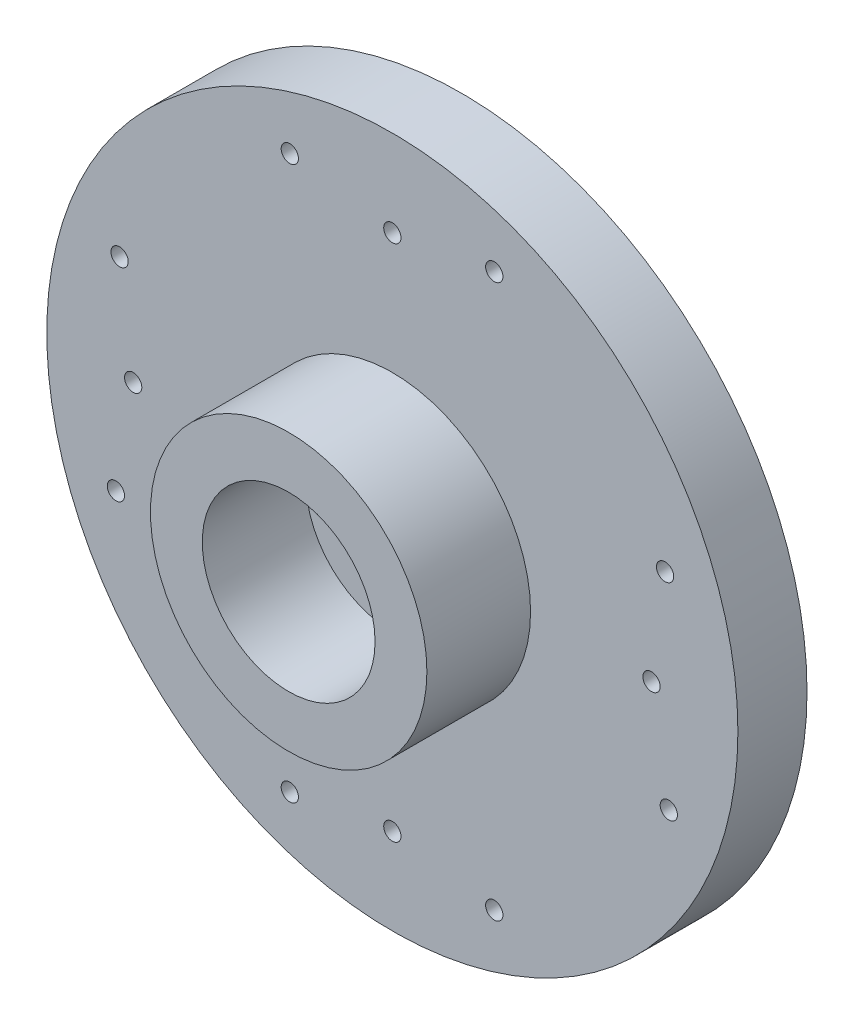
ISO-10303-21;
HEADER;
FILE_DESCRIPTION(('STEP AP214'),'2;1');
FILE_NAME('part.step','',(''),(''),'','','');
FILE_SCHEMA(('AUTOMOTIVE_DESIGN { 1 0 10303 214 1 1 1 1 }'));
ENDSEC;
DATA;
#1=APPLICATION_CONTEXT('core data for automotive mechanical design processes');
#2=APPLICATION_PROTOCOL_DEFINITION('international standard','automotive_design',2000,#1);
#3=PRODUCT_CONTEXT('',#1,'mechanical');
#4=PRODUCT('Part','Part','',(#3));
#5=PRODUCT_RELATED_PRODUCT_CATEGORY('part','',(#4));
#6=PRODUCT_DEFINITION_FORMATION('','',#4);
#7=PRODUCT_DEFINITION_CONTEXT('part definition',#1,'design');
#8=PRODUCT_DEFINITION('design','',#6,#7);
#9=PRODUCT_DEFINITION_SHAPE('','',#8);
#10=(LENGTH_UNIT() NAMED_UNIT(*) SI_UNIT(.MILLI.,.METRE.));
#11=(NAMED_UNIT(*) PLANE_ANGLE_UNIT() SI_UNIT($,.RADIAN.));
#12=(NAMED_UNIT(*) SI_UNIT($,.STERADIAN.) SOLID_ANGLE_UNIT());
#13=UNCERTAINTY_MEASURE_WITH_UNIT(LENGTH_MEASURE(1.E-05),#10,'distance_accuracy_value','');
#14=(GEOMETRIC_REPRESENTATION_CONTEXT(3) GLOBAL_UNCERTAINTY_ASSIGNED_CONTEXT((#13)) GLOBAL_UNIT_ASSIGNED_CONTEXT((#10,
#11,#12)) REPRESENTATION_CONTEXT('',''));
#15=CARTESIAN_POINT('',(0.,0.,0.));
#16=DIRECTION('',(0.,0.,1.));
#17=DIRECTION('',(1.,0.,0.));
#18=AXIS2_PLACEMENT_3D('',#15,#16,#17);
#19=CARTESIAN_POINT('',(0.,0.,2.4));
#20=DIRECTION('',(0.,0.,-1.));
#21=DIRECTION('',(-1.,0.,0.));
#22=AXIS2_PLACEMENT_3D('',#19,#20,#21);
#23=CYLINDRICAL_SURFACE('',#22,1.2);
#24=CARTESIAN_POINT('',(0.,0.,2.4));
#25=DIRECTION('',(0.,0.,1.));
#26=DIRECTION('',(1.,0.,0.));
#27=AXIS2_PLACEMENT_3D('',#24,#25,#26);
#28=CIRCLE('',#27,1.2);
#29=CARTESIAN_POINT('',(1.2,0.,2.4));
#30=VERTEX_POINT('',#29);
#31=EDGE_CURVE('E120',#30,#30,#28,.T.);
#32=ORIENTED_EDGE('',*,*,#31,.T.);
#33=EDGE_LOOP('',(#32));
#34=FACE_BOUND('',#33,.T.);
#35=CARTESIAN_POINT('',(0.,0.,0.6));
#36=DIRECTION('',(0.,0.,-1.));
#37=DIRECTION('',(-1.,0.,0.));
#38=AXIS2_PLACEMENT_3D('',#35,#36,#37);
#39=CIRCLE('',#38,1.2);
#40=CARTESIAN_POINT('',(-1.2,0.,0.6));
#41=VERTEX_POINT('',#40);
#42=EDGE_CURVE('E40',#41,#41,#39,.T.);
#43=ORIENTED_EDGE('',*,*,#42,.T.);
#44=EDGE_LOOP('',(#43));
#45=FACE_BOUND('',#44,.T.);
#46=ADVANCED_FACE('F36',(#34,#45),#23,.F.);
#47=CARTESIAN_POINT('',(0.,0.,2.4));
#48=DIRECTION('',(0.,0.,1.));
#49=DIRECTION('',(1.,0.,0.));
#50=AXIS2_PLACEMENT_3D('',#47,#48,#49);
#51=PLANE('',#50);
#52=CARTESIAN_POINT('',(3.53932517107282,9.6,2.4));
#53=DIRECTION('',(0.,0.,1.));
#54=DIRECTION('',(1.,0.,0.));
#55=AXIS2_PLACEMENT_3D('',#52,#53,#54);
#56=CIRCLE('',#55,0.3);
#57=CARTESIAN_POINT('',(3.83932517107282,9.6,2.4));
#58=VERTEX_POINT('',#57);
#59=EDGE_CURVE('E235',#58,#58,#56,.T.);
#60=ORIENTED_EDGE('',*,*,#59,.F.);
#61=EDGE_LOOP('',(#60));
#62=FACE_BOUND('',#61,.T.);
#63=CARTESIAN_POINT('',(0.,9.,2.4));
#64=DIRECTION('',(0.,0.,1.));
#65=DIRECTION('',(1.,0.,0.));
#66=AXIS2_PLACEMENT_3D('',#63,#64,#65);
#67=CIRCLE('',#66,0.3);
#68=CARTESIAN_POINT('',(0.300000000000001,9.,2.4));
#69=VERTEX_POINT('',#68);
#70=EDGE_CURVE('E227',#69,#69,#67,.T.);
#71=ORIENTED_EDGE('',*,*,#70,.F.);
#72=EDGE_LOOP('',(#71));
#73=FACE_BOUND('',#72,.T.);
#74=CARTESIAN_POINT('',(-3.56067482892718,9.6,2.4));
#75=DIRECTION('',(0.,0.,1.));
#76=DIRECTION('',(1.,0.,0.));
#77=AXIS2_PLACEMENT_3D('',#74,#75,#76);
#78=CIRCLE('',#77,0.3);
#79=CARTESIAN_POINT('',(-3.26067482892718,9.6,2.4));
#80=VERTEX_POINT('',#79);
#81=EDGE_CURVE('E212',#80,#80,#78,.T.);
#82=ORIENTED_EDGE('',*,*,#81,.F.);
#83=EDGE_LOOP('',(#82));
#84=FACE_BOUND('',#83,.T.);
#85=CARTESIAN_POINT('',(-9.,0.,2.4));
#86=DIRECTION('',(0.,0.,1.));
#87=DIRECTION('',(1.,0.,0.));
#88=AXIS2_PLACEMENT_3D('',#85,#86,#87);
#89=CIRCLE('',#88,0.3);
#90=CARTESIAN_POINT('',(-8.7,0.,2.4));
#91=VERTEX_POINT('',#90);
#92=EDGE_CURVE('E268',#91,#91,#89,.T.);
#93=ORIENTED_EDGE('',*,*,#92,.F.);
#94=EDGE_LOOP('',(#93));
#95=FACE_BOUND('',#94,.T.);
#96=CARTESIAN_POINT('',(-9.6,-3.56067482892722,2.4));
#97=DIRECTION('',(0.,0.,1.));
#98=DIRECTION('',(1.,0.,0.));
#99=AXIS2_PLACEMENT_3D('',#96,#97,#98);
#100=CIRCLE('',#99,0.3);
#101=CARTESIAN_POINT('',(-9.3,-3.56067482892722,2.4));
#102=VERTEX_POINT('',#101);
#103=EDGE_CURVE('E272',#102,#102,#100,.T.);
#104=ORIENTED_EDGE('',*,*,#103,.F.);
#105=EDGE_LOOP('',(#104));
#106=FACE_BOUND('',#105,.T.);
#107=CARTESIAN_POINT('',(9.,0.,2.4));
#108=DIRECTION('',(0.,0.,1.));
#109=DIRECTION('',(1.,0.,0.));
#110=AXIS2_PLACEMENT_3D('',#107,#108,#109);
#111=CIRCLE('',#110,0.3);
#112=CARTESIAN_POINT('',(9.3,0.,2.4));
#113=VERTEX_POINT('',#112);
#114=EDGE_CURVE('E238',#113,#113,#111,.F.);
#115=ORIENTED_EDGE('',*,*,#114,.T.);
#116=EDGE_LOOP('',(#115));
#117=FACE_BOUND('',#116,.T.);
#118=CARTESIAN_POINT('',(-3.56067482892718,-9.6,2.4));
#119=DIRECTION('',(0.,0.,1.));
#120=DIRECTION('',(1.,0.,0.));
#121=AXIS2_PLACEMENT_3D('',#118,#119,#120);
#122=CIRCLE('',#121,0.3);
#123=CARTESIAN_POINT('',(-3.26067482892718,-9.6,2.4));
#124=VERTEX_POINT('',#123);
#125=EDGE_CURVE('E232',#124,#124,#122,.F.);
#126=ORIENTED_EDGE('',*,*,#125,.T.);
#127=EDGE_LOOP('',(#126));
#128=FACE_BOUND('',#127,.T.);
#129=CARTESIAN_POINT('',(9.6,-3.56067482892722,2.4));
#130=DIRECTION('',(0.,0.,1.));
#131=DIRECTION('',(1.,0.,0.));
#132=AXIS2_PLACEMENT_3D('',#129,#130,#131);
#133=CIRCLE('',#132,0.3);
#134=CARTESIAN_POINT('',(9.9,-3.56067482892722,2.4));
#135=VERTEX_POINT('',#134);
#136=EDGE_CURVE('E261',#135,#135,#133,.F.);
#137=ORIENTED_EDGE('',*,*,#136,.T.);
#138=EDGE_LOOP('',(#137));
#139=FACE_BOUND('',#138,.T.);
#140=CARTESIAN_POINT('',(-9.4711699275262,3.54215691710382,2.4));
#141=DIRECTION('',(0.,0.,1.));
#142=DIRECTION('',(1.,0.,0.));
#143=AXIS2_PLACEMENT_3D('',#140,#141,#142);
#144=CIRCLE('',#143,0.3);
#145=CARTESIAN_POINT('',(-9.1711699275262,3.54215691710382,2.4));
#146=VERTEX_POINT('',#145);
#147=EDGE_CURVE('E60',#146,#146,#144,.T.);
#148=ORIENTED_EDGE('',*,*,#147,.F.);
#149=EDGE_LOOP('',(#148));
#150=FACE_BOUND('',#149,.T.);
#151=CARTESIAN_POINT('',(0.,0.,2.4));
#152=DIRECTION('',(0.,0.,1.));
#153=DIRECTION('',(1.,0.,0.));
#154=AXIS2_PLACEMENT_3D('',#151,#152,#153);
#155=CIRCLE('',#154,4.8);
#156=CARTESIAN_POINT('',(4.8,0.,2.4));
#157=VERTEX_POINT('',#156);
#158=EDGE_CURVE('E107',#157,#157,#155,.T.);
#159=ORIENTED_EDGE('',*,*,#158,.F.);
#160=EDGE_LOOP('',(#159));
#161=FACE_BOUND('',#160,.T.);
#162=CARTESIAN_POINT('',(0.,0.,2.4));
#163=DIRECTION('',(0.,0.,1.));
#164=DIRECTION('',(1.,0.,0.));
#165=AXIS2_PLACEMENT_3D('',#162,#163,#164);
#166=CIRCLE('',#165,12.);
#167=CARTESIAN_POINT('',(12.,0.,2.4));
#168=VERTEX_POINT('',#167);
#169=EDGE_CURVE('E45',#168,#168,#166,.T.);
#170=ORIENTED_EDGE('',*,*,#169,.T.);
#171=EDGE_LOOP('',(#170));
#172=FACE_BOUND('',#171,.T.);
#173=CARTESIAN_POINT('',(0.,-9.,2.4));
#174=DIRECTION('',(0.,0.,1.));
#175=DIRECTION('',(1.,0.,0.));
#176=AXIS2_PLACEMENT_3D('',#173,#174,#175);
#177=CIRCLE('',#176,0.3);
#178=CARTESIAN_POINT('',(0.299999999999994,-9.,2.4));
#179=VERTEX_POINT('',#178);
#180=EDGE_CURVE('E259',#179,#179,#177,.F.);
#181=ORIENTED_EDGE('',*,*,#180,.T.);
#182=EDGE_LOOP('',(#181));
#183=FACE_BOUND('',#182,.T.);
#184=CARTESIAN_POINT('',(3.53932517107282,-9.6,2.4));
#185=DIRECTION('',(0.,0.,1.));
#186=DIRECTION('',(1.,0.,0.));
#187=AXIS2_PLACEMENT_3D('',#184,#185,#186);
#188=CIRCLE('',#187,0.3);
#189=CARTESIAN_POINT('',(3.83932517107282,-9.6,2.4));
#190=VERTEX_POINT('',#189);
#191=EDGE_CURVE('E226',#190,#190,#188,.F.);
#192=ORIENTED_EDGE('',*,*,#191,.T.);
#193=EDGE_LOOP('',(#192));
#194=FACE_BOUND('',#193,.T.);
#195=CARTESIAN_POINT('',(9.4711699275262,3.54215691710382,2.4));
#196=DIRECTION('',(0.,0.,1.));
#197=DIRECTION('',(1.,0.,0.));
#198=AXIS2_PLACEMENT_3D('',#195,#196,#197);
#199=CIRCLE('',#198,0.3);
#200=CARTESIAN_POINT('',(9.7711699275262,3.54215691710382,2.4));
#201=VERTEX_POINT('',#200);
#202=EDGE_CURVE('E275',#201,#201,#199,.F.);
#203=ORIENTED_EDGE('',*,*,#202,.T.);
#204=EDGE_LOOP('',(#203));
#205=FACE_BOUND('',#204,.T.);
#206=ADVANCED_FACE('F135',(#62,#73,#84,#95,#106,#117,#128,#139,#150,#161,#172,#183,#194,#205),
#51,.T.);
#207=CARTESIAN_POINT('',(0.,0.,0.));
#208=DIRECTION('',(0.,0.,1.));
#209=DIRECTION('',(1.,0.,0.));
#210=AXIS2_PLACEMENT_3D('',#207,#208,#209);
#211=PLANE('',#210);
#212=CARTESIAN_POINT('',(0.,0.,0.));
#213=DIRECTION('',(0.,0.,-1.));
#214=DIRECTION('',(-1.,0.,0.));
#215=AXIS2_PLACEMENT_3D('',#212,#213,#214);
#216=CIRCLE('',#215,3.6);
#217=CARTESIAN_POINT('',(-3.6,0.,0.));
#218=VERTEX_POINT('',#217);
#219=EDGE_CURVE('E249',#218,#218,#216,.T.);
#220=ORIENTED_EDGE('',*,*,#219,.F.);
#221=EDGE_LOOP('',(#220));
#222=FACE_BOUND('',#221,.T.);
#223=CARTESIAN_POINT('',(3.53932517107282,9.6,0.));
#224=DIRECTION('',(0.,0.,1.));
#225=DIRECTION('',(1.,0.,0.));
#226=AXIS2_PLACEMENT_3D('',#223,#224,#225);
#227=CIRCLE('',#226,0.3);
#228=CARTESIAN_POINT('',(3.83932517107282,9.6,0.));
#229=VERTEX_POINT('',#228);
#230=EDGE_CURVE('E99',#229,#229,#227,.T.);
#231=ORIENTED_EDGE('',*,*,#230,.T.);
#232=EDGE_LOOP('',(#231));
#233=FACE_BOUND('',#232,.T.);
#234=CARTESIAN_POINT('',(0.,9.,0.));
#235=DIRECTION('',(0.,0.,1.));
#236=DIRECTION('',(1.,0.,0.));
#237=AXIS2_PLACEMENT_3D('',#234,#235,#236);
#238=CIRCLE('',#237,0.3);
#239=CARTESIAN_POINT('',(0.300000000000001,9.,0.));
#240=VERTEX_POINT('',#239);
#241=EDGE_CURVE('E96',#240,#240,#238,.T.);
#242=ORIENTED_EDGE('',*,*,#241,.T.);
#243=EDGE_LOOP('',(#242));
#244=FACE_BOUND('',#243,.T.);
#245=CARTESIAN_POINT('',(-3.56067482892718,9.6,0.));
#246=DIRECTION('',(0.,0.,1.));
#247=DIRECTION('',(1.,0.,0.));
#248=AXIS2_PLACEMENT_3D('',#245,#246,#247);
#249=CIRCLE('',#248,0.3);
#250=CARTESIAN_POINT('',(-3.26067482892718,9.6,0.));
#251=VERTEX_POINT('',#250);
#252=EDGE_CURVE('E92',#251,#251,#249,.T.);
#253=ORIENTED_EDGE('',*,*,#252,.T.);
#254=EDGE_LOOP('',(#253));
#255=FACE_BOUND('',#254,.T.);
#256=CARTESIAN_POINT('',(-9.,0.,0.));
#257=DIRECTION('',(0.,0.,1.));
#258=DIRECTION('',(1.,0.,0.));
#259=AXIS2_PLACEMENT_3D('',#256,#257,#258);
#260=CIRCLE('',#259,0.3);
#261=CARTESIAN_POINT('',(-8.7,0.,0.));
#262=VERTEX_POINT('',#261);
#263=EDGE_CURVE('E88',#262,#262,#260,.T.);
#264=ORIENTED_EDGE('',*,*,#263,.T.);
#265=EDGE_LOOP('',(#264));
#266=FACE_BOUND('',#265,.T.);
#267=CARTESIAN_POINT('',(-9.6,-3.56067482892722,0.));
#268=DIRECTION('',(0.,0.,1.));
#269=DIRECTION('',(1.,0.,0.));
#270=AXIS2_PLACEMENT_3D('',#267,#268,#269);
#271=CIRCLE('',#270,0.3);
#272=CARTESIAN_POINT('',(-9.3,-3.56067482892722,0.));
#273=VERTEX_POINT('',#272);
#274=EDGE_CURVE('E84',#273,#273,#271,.T.);
#275=ORIENTED_EDGE('',*,*,#274,.T.);
#276=EDGE_LOOP('',(#275));
#277=FACE_BOUND('',#276,.T.);
#278=CARTESIAN_POINT('',(-9.4711699275262,3.54215691710382,0.));
#279=DIRECTION('',(0.,0.,1.));
#280=DIRECTION('',(1.,0.,0.));
#281=AXIS2_PLACEMENT_3D('',#278,#279,#280);
#282=CIRCLE('',#281,0.3);
#283=CARTESIAN_POINT('',(-9.1711699275262,3.54215691710382,0.));
#284=VERTEX_POINT('',#283);
#285=EDGE_CURVE('E55',#284,#284,#282,.T.);
#286=ORIENTED_EDGE('',*,*,#285,.T.);
#287=EDGE_LOOP('',(#286));
#288=FACE_BOUND('',#287,.T.);
#289=CARTESIAN_POINT('',(0.,0.,0.));
#290=DIRECTION('',(0.,0.,1.));
#291=DIRECTION('',(1.,0.,0.));
#292=AXIS2_PLACEMENT_3D('',#289,#290,#291);
#293=CIRCLE('',#292,12.);
#294=CARTESIAN_POINT('',(12.,0.,0.));
#295=VERTEX_POINT('',#294);
#296=EDGE_CURVE('E51',#295,#295,#293,.T.);
#297=ORIENTED_EDGE('',*,*,#296,.F.);
#298=EDGE_LOOP('',(#297));
#299=FACE_BOUND('',#298,.T.);
#300=CARTESIAN_POINT('',(9.6,-3.56067482892722,0.));
#301=DIRECTION('',(0.,0.,1.));
#302=DIRECTION('',(1.,0.,0.));
#303=AXIS2_PLACEMENT_3D('',#300,#301,#302);
#304=CIRCLE('',#303,0.3);
#305=CARTESIAN_POINT('',(9.9,-3.56067482892722,0.));
#306=VERTEX_POINT('',#305);
#307=EDGE_CURVE('E59',#306,#306,#304,.F.);
#308=ORIENTED_EDGE('',*,*,#307,.F.);
#309=EDGE_LOOP('',(#308));
#310=FACE_BOUND('',#309,.T.);
#311=CARTESIAN_POINT('',(0.,-9.,0.));
#312=DIRECTION('',(0.,0.,1.));
#313=DIRECTION('',(1.,0.,0.));
#314=AXIS2_PLACEMENT_3D('',#311,#312,#313);
#315=CIRCLE('',#314,0.3);
#316=CARTESIAN_POINT('',(0.299999999999994,-9.,0.));
#317=VERTEX_POINT('',#316);
#318=EDGE_CURVE('E64',#317,#317,#315,.F.);
#319=ORIENTED_EDGE('',*,*,#318,.F.);
#320=EDGE_LOOP('',(#319));
#321=FACE_BOUND('',#320,.T.);
#322=CARTESIAN_POINT('',(-3.56067482892718,-9.6,0.));
#323=DIRECTION('',(0.,0.,1.));
#324=DIRECTION('',(1.,0.,0.));
#325=AXIS2_PLACEMENT_3D('',#322,#323,#324);
#326=CIRCLE('',#325,0.3);
#327=CARTESIAN_POINT('',(-3.26067482892718,-9.6,0.));
#328=VERTEX_POINT('',#327);
#329=EDGE_CURVE('E68',#328,#328,#326,.F.);
#330=ORIENTED_EDGE('',*,*,#329,.F.);
#331=EDGE_LOOP('',(#330));
#332=FACE_BOUND('',#331,.T.);
#333=CARTESIAN_POINT('',(3.53932517107282,-9.6,0.));
#334=DIRECTION('',(0.,0.,1.));
#335=DIRECTION('',(1.,0.,0.));
#336=AXIS2_PLACEMENT_3D('',#333,#334,#335);
#337=CIRCLE('',#336,0.3);
#338=CARTESIAN_POINT('',(3.83932517107282,-9.6,0.));
#339=VERTEX_POINT('',#338);
#340=EDGE_CURVE('E72',#339,#339,#337,.F.);
#341=ORIENTED_EDGE('',*,*,#340,.F.);
#342=EDGE_LOOP('',(#341));
#343=FACE_BOUND('',#342,.T.);
#344=CARTESIAN_POINT('',(9.,0.,0.));
#345=DIRECTION('',(0.,0.,1.));
#346=DIRECTION('',(1.,0.,0.));
#347=AXIS2_PLACEMENT_3D('',#344,#345,#346);
#348=CIRCLE('',#347,0.3);
#349=CARTESIAN_POINT('',(9.3,0.,0.));
#350=VERTEX_POINT('',#349);
#351=EDGE_CURVE('E76',#350,#350,#348,.F.);
#352=ORIENTED_EDGE('',*,*,#351,.F.);
#353=EDGE_LOOP('',(#352));
#354=FACE_BOUND('',#353,.T.);
#355=CARTESIAN_POINT('',(9.4711699275262,3.54215691710382,0.));
#356=DIRECTION('',(0.,0.,1.));
#357=DIRECTION('',(1.,0.,0.));
#358=AXIS2_PLACEMENT_3D('',#355,#356,#357);
#359=CIRCLE('',#358,0.3);
#360=CARTESIAN_POINT('',(9.7711699275262,3.54215691710382,0.));
#361=VERTEX_POINT('',#360);
#362=EDGE_CURVE('E80',#361,#361,#359,.F.);
#363=ORIENTED_EDGE('',*,*,#362,.F.);
#364=EDGE_LOOP('',(#363));
#365=FACE_BOUND('',#364,.T.);
#366=ADVANCED_FACE('F131',(#222,#233,#244,#255,#266,#277,#288,#299,#310,#321,#332,#343,#354,
#365),#211,.F.);
#367=ORIENTED_EDGE('',*,*,#31,.F.);
#368=EDGE_LOOP('',(#367));
#369=FACE_BOUND('',#368,.T.);
#370=CARTESIAN_POINT('',(0.,0.,2.4));
#371=DIRECTION('',(0.,0.,1.));
#372=DIRECTION('',(1.,0.,0.));
#373=AXIS2_PLACEMENT_3D('',#370,#371,#372);
#374=CIRCLE('',#373,3.);
#375=CARTESIAN_POINT('',(3.,0.,2.4));
#376=VERTEX_POINT('',#375);
#377=EDGE_CURVE('E10',#376,#376,#374,.F.);
#378=ORIENTED_EDGE('',*,*,#377,.F.);
#379=EDGE_LOOP('',(#378));
#380=FACE_BOUND('',#379,.T.);
#381=ADVANCED_FACE('F134',(#369,#380),#51,.T.);
#382=CARTESIAN_POINT('',(0.,0.,2.4));
#383=DIRECTION('',(0.,0.,-1.));
#384=DIRECTION('',(-1.,0.,0.));
#385=AXIS2_PLACEMENT_3D('',#382,#383,#384);
#386=CYLINDRICAL_SURFACE('',#385,12.);
#387=ORIENTED_EDGE('',*,*,#169,.F.);
#388=EDGE_LOOP('',(#387));
#389=FACE_BOUND('',#388,.T.);
#390=ORIENTED_EDGE('',*,*,#296,.T.);
#391=EDGE_LOOP('',(#390));
#392=FACE_BOUND('',#391,.T.);
#393=ADVANCED_FACE('F38',(#389,#392),#386,.T.);
#394=CARTESIAN_POINT('',(0.,0.,6.));
#395=DIRECTION('',(0.,0.,1.));
#396=DIRECTION('',(1.,0.,0.));
#397=AXIS2_PLACEMENT_3D('',#394,#395,#396);
#398=PLANE('',#397);
#399=CARTESIAN_POINT('',(0.,0.,6.));
#400=DIRECTION('',(0.,0.,1.));
#401=DIRECTION('',(1.,0.,0.));
#402=AXIS2_PLACEMENT_3D('',#399,#400,#401);
#403=CIRCLE('',#402,4.8);
#404=CARTESIAN_POINT('',(4.8,0.,6.));
#405=VERTEX_POINT('',#404);
#406=EDGE_CURVE('E113',#405,#405,#403,.T.);
#407=ORIENTED_EDGE('',*,*,#406,.T.);
#408=EDGE_LOOP('',(#407));
#409=FACE_BOUND('',#408,.T.);
#410=CARTESIAN_POINT('',(0.,0.,6.));
#411=DIRECTION('',(0.,0.,1.));
#412=DIRECTION('',(1.,0.,0.));
#413=AXIS2_PLACEMENT_3D('',#410,#411,#412);
#414=CIRCLE('',#413,3.);
#415=CARTESIAN_POINT('',(3.,0.,6.));
#416=VERTEX_POINT('',#415);
#417=EDGE_CURVE('E102',#416,#416,#414,.T.);
#418=ORIENTED_EDGE('',*,*,#417,.F.);
#419=EDGE_LOOP('',(#418));
#420=FACE_BOUND('',#419,.T.);
#421=ADVANCED_FACE('F180',(#409,#420),#398,.T.);
#422=CARTESIAN_POINT('',(0.,0.,6.));
#423=DIRECTION('',(0.,0.,-1.));
#424=DIRECTION('',(-1.,0.,0.));
#425=AXIS2_PLACEMENT_3D('',#422,#423,#424);
#426=CYLINDRICAL_SURFACE('',#425,4.8);
#427=ORIENTED_EDGE('',*,*,#406,.F.);
#428=EDGE_LOOP('',(#427));
#429=FACE_BOUND('',#428,.T.);
#430=ORIENTED_EDGE('',*,*,#158,.T.);
#431=EDGE_LOOP('',(#430));
#432=FACE_BOUND('',#431,.T.);
#433=ADVANCED_FACE('F176',(#429,#432),#426,.T.);
#434=CARTESIAN_POINT('',(0.,0.,6.));
#435=DIRECTION('',(0.,0.,-1.));
#436=DIRECTION('',(-1.,0.,0.));
#437=AXIS2_PLACEMENT_3D('',#434,#435,#436);
#438=CYLINDRICAL_SURFACE('',#437,3.);
#439=ORIENTED_EDGE('',*,*,#417,.T.);
#440=EDGE_LOOP('',(#439));
#441=FACE_BOUND('',#440,.T.);
#442=ORIENTED_EDGE('',*,*,#377,.T.);
#443=EDGE_LOOP('',(#442));
#444=FACE_BOUND('',#443,.T.);
#445=ADVANCED_FACE('F179',(#441,#444),#438,.F.);
#446=CARTESIAN_POINT('',(-9.4711699275262,3.54215691710382,-1.2));
#447=DIRECTION('',(0.,0.,1.));
#448=DIRECTION('',(1.,0.,0.));
#449=AXIS2_PLACEMENT_3D('',#446,#447,#448);
#450=CYLINDRICAL_SURFACE('',#449,0.3);
#451=ORIENTED_EDGE('',*,*,#147,.T.);
#452=EDGE_LOOP('',(#451));
#453=FACE_BOUND('',#452,.T.);
#454=ORIENTED_EDGE('',*,*,#285,.F.);
#455=EDGE_LOOP('',(#454));
#456=FACE_BOUND('',#455,.T.);
#457=ADVANCED_FACE('F187',(#453,#456),#450,.F.);
#458=CARTESIAN_POINT('',(9.6,-3.56067482892722,-1.2));
#459=DIRECTION('',(0.,0.,1.));
#460=DIRECTION('',(1.,0.,0.));
#461=AXIS2_PLACEMENT_3D('',#458,#459,#460);
#462=CYLINDRICAL_SURFACE('',#461,0.3);
#463=ORIENTED_EDGE('',*,*,#136,.F.);
#464=EDGE_LOOP('',(#463));
#465=FACE_BOUND('',#464,.T.);
#466=ORIENTED_EDGE('',*,*,#307,.T.);
#467=EDGE_LOOP('',(#466));
#468=FACE_BOUND('',#467,.T.);
#469=ADVANCED_FACE('F190',(#465,#468),#462,.F.);
#470=CARTESIAN_POINT('',(0.,-9.,-1.2));
#471=DIRECTION('',(0.,0.,1.));
#472=DIRECTION('',(1.,0.,0.));
#473=AXIS2_PLACEMENT_3D('',#470,#471,#472);
#474=CYLINDRICAL_SURFACE('',#473,0.3);
#475=ORIENTED_EDGE('',*,*,#180,.F.);
#476=EDGE_LOOP('',(#475));
#477=FACE_BOUND('',#476,.T.);
#478=ORIENTED_EDGE('',*,*,#318,.T.);
#479=EDGE_LOOP('',(#478));
#480=FACE_BOUND('',#479,.T.);
#481=ADVANCED_FACE('F307',(#477,#480),#474,.F.);
#482=CARTESIAN_POINT('',(-3.56067482892718,-9.6,-1.2));
#483=DIRECTION('',(0.,0.,1.));
#484=DIRECTION('',(1.,0.,0.));
#485=AXIS2_PLACEMENT_3D('',#482,#483,#484);
#486=CYLINDRICAL_SURFACE('',#485,0.3);
#487=ORIENTED_EDGE('',*,*,#125,.F.);
#488=EDGE_LOOP('',(#487));
#489=FACE_BOUND('',#488,.T.);
#490=ORIENTED_EDGE('',*,*,#329,.T.);
#491=EDGE_LOOP('',(#490));
#492=FACE_BOUND('',#491,.T.);
#493=ADVANCED_FACE('F302',(#489,#492),#486,.F.);
#494=CARTESIAN_POINT('',(3.53932517107282,-9.6,-1.2));
#495=DIRECTION('',(0.,0.,1.));
#496=DIRECTION('',(1.,0.,0.));
#497=AXIS2_PLACEMENT_3D('',#494,#495,#496);
#498=CYLINDRICAL_SURFACE('',#497,0.3);
#499=ORIENTED_EDGE('',*,*,#191,.F.);
#500=EDGE_LOOP('',(#499));
#501=FACE_BOUND('',#500,.T.);
#502=ORIENTED_EDGE('',*,*,#340,.T.);
#503=EDGE_LOOP('',(#502));
#504=FACE_BOUND('',#503,.T.);
#505=ADVANCED_FACE('F162',(#501,#504),#498,.F.);
#506=CARTESIAN_POINT('',(9.,0.,-1.2));
#507=DIRECTION('',(0.,0.,1.));
#508=DIRECTION('',(1.,0.,0.));
#509=AXIS2_PLACEMENT_3D('',#506,#507,#508);
#510=CYLINDRICAL_SURFACE('',#509,0.3);
#511=ORIENTED_EDGE('',*,*,#114,.F.);
#512=EDGE_LOOP('',(#511));
#513=FACE_BOUND('',#512,.T.);
#514=ORIENTED_EDGE('',*,*,#351,.T.);
#515=EDGE_LOOP('',(#514));
#516=FACE_BOUND('',#515,.T.);
#517=ADVANCED_FACE('F152',(#513,#516),#510,.F.);
#518=CARTESIAN_POINT('',(9.4711699275262,3.54215691710382,-1.2));
#519=DIRECTION('',(0.,0.,1.));
#520=DIRECTION('',(1.,0.,0.));
#521=AXIS2_PLACEMENT_3D('',#518,#519,#520);
#522=CYLINDRICAL_SURFACE('',#521,0.3);
#523=ORIENTED_EDGE('',*,*,#202,.F.);
#524=EDGE_LOOP('',(#523));
#525=FACE_BOUND('',#524,.T.);
#526=ORIENTED_EDGE('',*,*,#362,.T.);
#527=EDGE_LOOP('',(#526));
#528=FACE_BOUND('',#527,.T.);
#529=ADVANCED_FACE('F149',(#525,#528),#522,.F.);
#530=CARTESIAN_POINT('',(-9.6,-3.56067482892722,-1.2));
#531=DIRECTION('',(0.,0.,1.));
#532=DIRECTION('',(1.,0.,0.));
#533=AXIS2_PLACEMENT_3D('',#530,#531,#532);
#534=CYLINDRICAL_SURFACE('',#533,0.3);
#535=ORIENTED_EDGE('',*,*,#103,.T.);
#536=EDGE_LOOP('',(#535));
#537=FACE_BOUND('',#536,.T.);
#538=ORIENTED_EDGE('',*,*,#274,.F.);
#539=EDGE_LOOP('',(#538));
#540=FACE_BOUND('',#539,.T.);
#541=ADVANCED_FACE('F151',(#537,#540),#534,.F.);
#542=CARTESIAN_POINT('',(-9.,0.,-1.2));
#543=DIRECTION('',(0.,0.,1.));
#544=DIRECTION('',(1.,0.,0.));
#545=AXIS2_PLACEMENT_3D('',#542,#543,#544);
#546=CYLINDRICAL_SURFACE('',#545,0.3);
#547=ORIENTED_EDGE('',*,*,#92,.T.);
#548=EDGE_LOOP('',(#547));
#549=FACE_BOUND('',#548,.T.);
#550=ORIENTED_EDGE('',*,*,#263,.F.);
#551=EDGE_LOOP('',(#550));
#552=FACE_BOUND('',#551,.T.);
#553=ADVANCED_FACE('F159',(#549,#552),#546,.F.);
#554=CARTESIAN_POINT('',(-3.56067482892718,9.6,-1.2));
#555=DIRECTION('',(0.,0.,1.));
#556=DIRECTION('',(1.,0.,0.));
#557=AXIS2_PLACEMENT_3D('',#554,#555,#556);
#558=CYLINDRICAL_SURFACE('',#557,0.3);
#559=ORIENTED_EDGE('',*,*,#81,.T.);
#560=EDGE_LOOP('',(#559));
#561=FACE_BOUND('',#560,.T.);
#562=ORIENTED_EDGE('',*,*,#252,.F.);
#563=EDGE_LOOP('',(#562));
#564=FACE_BOUND('',#563,.T.);
#565=ADVANCED_FACE('F200',(#561,#564),#558,.F.);
#566=CARTESIAN_POINT('',(0.,9.,-1.2));
#567=DIRECTION('',(0.,0.,1.));
#568=DIRECTION('',(1.,0.,0.));
#569=AXIS2_PLACEMENT_3D('',#566,#567,#568);
#570=CYLINDRICAL_SURFACE('',#569,0.3);
#571=ORIENTED_EDGE('',*,*,#70,.T.);
#572=EDGE_LOOP('',(#571));
#573=FACE_BOUND('',#572,.T.);
#574=ORIENTED_EDGE('',*,*,#241,.F.);
#575=EDGE_LOOP('',(#574));
#576=FACE_BOUND('',#575,.T.);
#577=ADVANCED_FACE('F196',(#573,#576),#570,.F.);
#578=CARTESIAN_POINT('',(3.53932517107282,9.6,-1.2));
#579=DIRECTION('',(0.,0.,1.));
#580=DIRECTION('',(1.,0.,0.));
#581=AXIS2_PLACEMENT_3D('',#578,#579,#580);
#582=CYLINDRICAL_SURFACE('',#581,0.3);
#583=ORIENTED_EDGE('',*,*,#59,.T.);
#584=EDGE_LOOP('',(#583));
#585=FACE_BOUND('',#584,.T.);
#586=ORIENTED_EDGE('',*,*,#230,.F.);
#587=EDGE_LOOP('',(#586));
#588=FACE_BOUND('',#587,.T.);
#589=ADVANCED_FACE('F192',(#585,#588),#582,.F.);
#590=CARTESIAN_POINT('',(0.,0.,0.6));
#591=DIRECTION('',(0.,0.,-1.));
#592=DIRECTION('',(-1.,0.,0.));
#593=AXIS2_PLACEMENT_3D('',#590,#591,#592);
#594=CYLINDRICAL_SURFACE('',#593,3.6);
#595=CARTESIAN_POINT('',(0.,0.,0.6));
#596=DIRECTION('',(0.,0.,-1.));
#597=DIRECTION('',(-1.,0.,0.));
#598=AXIS2_PLACEMENT_3D('',#595,#596,#597);
#599=CIRCLE('',#598,3.6);
#600=CARTESIAN_POINT('',(-3.6,0.,0.6));
#601=VERTEX_POINT('',#600);
#602=EDGE_CURVE('E245',#601,#601,#599,.T.);
#603=ORIENTED_EDGE('',*,*,#602,.F.);
#604=EDGE_LOOP('',(#603));
#605=FACE_BOUND('',#604,.T.);
#606=ORIENTED_EDGE('',*,*,#219,.T.);
#607=EDGE_LOOP('',(#606));
#608=FACE_BOUND('',#607,.T.);
#609=ADVANCED_FACE('F195',(#605,#608),#594,.F.);
#610=CARTESIAN_POINT('',(0.,0.,0.6));
#611=DIRECTION('',(0.,0.,-1.));
#612=DIRECTION('',(-1.,0.,0.));
#613=AXIS2_PLACEMENT_3D('',#610,#611,#612);
#614=PLANE('',#613);
#615=ORIENTED_EDGE('',*,*,#42,.F.);
#616=EDGE_LOOP('',(#615));
#617=FACE_BOUND('',#616,.T.);
#618=ORIENTED_EDGE('',*,*,#602,.T.);
#619=EDGE_LOOP('',(#618));
#620=FACE_BOUND('',#619,.T.);
#621=ADVANCED_FACE('F380',(#617,#620),#614,.T.);
#622=CLOSED_SHELL('',(#46,#206,#366,#381,#393,#421,#433,#445,#457,#469,#481,#493,#505,#517,#529,
#541,#553,#565,#577,#589,#609,#621));
#623=MANIFOLD_SOLID_BREP('B2',#622);
#624=ADVANCED_BREP_SHAPE_REPRESENTATION('',(#18,#623),#14);
#625=SHAPE_DEFINITION_REPRESENTATION(#9,#624);
ENDSEC;
END-ISO-10303-21;
